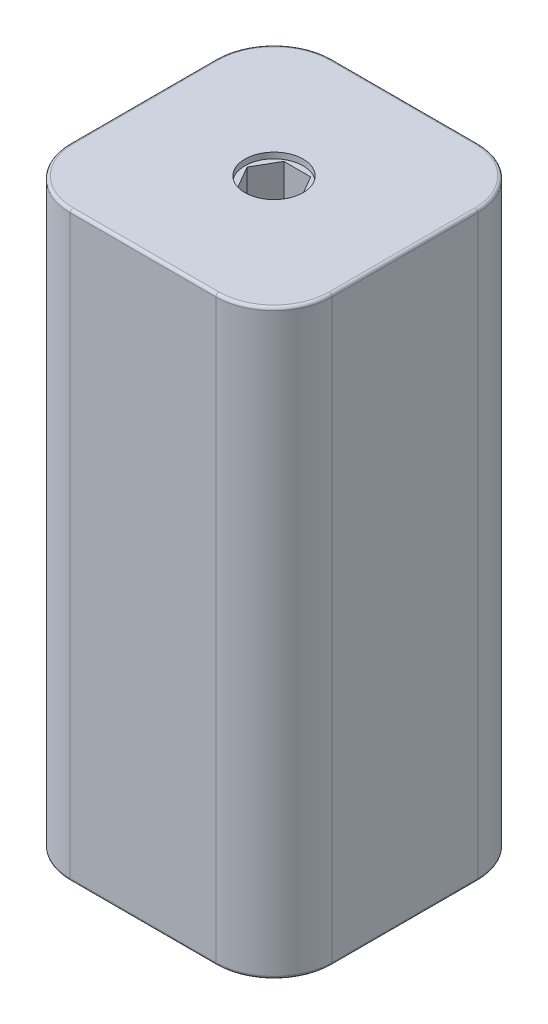
ISO-10303-21;
HEADER;
FILE_DESCRIPTION(('STEP AP214'),'2;1');
FILE_NAME('part.step','',(''),(''),'','','');
FILE_SCHEMA(('AUTOMOTIVE_DESIGN { 1 0 10303 214 1 1 1 1 }'));
ENDSEC;
DATA;
#1=APPLICATION_CONTEXT('core data for automotive mechanical design processes');
#2=APPLICATION_PROTOCOL_DEFINITION('international standard','automotive_design',2000,#1);
#3=PRODUCT_CONTEXT('',#1,'mechanical');
#4=PRODUCT('Part','Part','',(#3));
#5=PRODUCT_RELATED_PRODUCT_CATEGORY('part','',(#4));
#6=PRODUCT_DEFINITION_FORMATION('','',#4);
#7=PRODUCT_DEFINITION_CONTEXT('part definition',#1,'design');
#8=PRODUCT_DEFINITION('design','',#6,#7);
#9=PRODUCT_DEFINITION_SHAPE('','',#8);
#10=(LENGTH_UNIT() NAMED_UNIT(*) SI_UNIT(.MILLI.,.METRE.));
#11=(NAMED_UNIT(*) PLANE_ANGLE_UNIT() SI_UNIT($,.RADIAN.));
#12=(NAMED_UNIT(*) SI_UNIT($,.STERADIAN.) SOLID_ANGLE_UNIT());
#13=UNCERTAINTY_MEASURE_WITH_UNIT(LENGTH_MEASURE(1.E-05),#10,'distance_accuracy_value','');
#14=(GEOMETRIC_REPRESENTATION_CONTEXT(3) GLOBAL_UNCERTAINTY_ASSIGNED_CONTEXT((#13)) GLOBAL_UNIT_ASSIGNED_CONTEXT((#10,
#11,#12)) REPRESENTATION_CONTEXT('',''));
#15=CARTESIAN_POINT('',(0.,0.,0.));
#16=DIRECTION('',(0.,0.,1.));
#17=DIRECTION('',(1.,0.,0.));
#18=AXIS2_PLACEMENT_3D('',#15,#16,#17);
#19=CARTESIAN_POINT('',(22.5,-100.,22.5));
#20=DIRECTION('',(1.,0.,0.));
#21=DIRECTION('',(0.,0.,-1.));
#22=AXIS2_PLACEMENT_3D('',#19,#20,#21);
#23=PLANE('',#22);
#24=DIRECTION('',(0.,1.,0.));
#25=VECTOR('',#24,1.);
#26=CARTESIAN_POINT('',(22.5,-100.,-12.5));
#27=LINE('',#26,#25);
#28=CARTESIAN_POINT('',(22.5,-99.5,-12.5));
#29=VERTEX_POINT('',#28);
#30=CARTESIAN_POINT('',(22.5,-0.5,-12.5));
#31=VERTEX_POINT('',#30);
#32=EDGE_CURVE('E261',#29,#31,#27,.T.);
#33=ORIENTED_EDGE('',*,*,#32,.T.);
#34=DIRECTION('',(0.,0.,-1.));
#35=VECTOR('',#34,1.);
#36=CARTESIAN_POINT('',(22.5,-0.5,12.5));
#37=LINE('',#36,#35);
#38=CARTESIAN_POINT('',(22.5,-0.5,12.5));
#39=VERTEX_POINT('',#38);
#40=EDGE_CURVE('E294',#31,#39,#37,.F.);
#41=ORIENTED_EDGE('',*,*,#40,.T.);
#42=DIRECTION('',(0.,1.,0.));
#43=VECTOR('',#42,1.);
#44=CARTESIAN_POINT('',(22.5,-100.,12.5));
#45=LINE('',#44,#43);
#46=CARTESIAN_POINT('',(22.5,-99.5,12.5));
#47=VERTEX_POINT('',#46);
#48=EDGE_CURVE('E258',#39,#47,#45,.F.);
#49=ORIENTED_EDGE('',*,*,#48,.T.);
#50=DIRECTION('',(0.,0.,-1.));
#51=VECTOR('',#50,1.);
#52=CARTESIAN_POINT('',(22.5,-99.5,22.5));
#53=LINE('',#52,#51);
#54=EDGE_CURVE('E292',#47,#29,#53,.T.);
#55=ORIENTED_EDGE('',*,*,#54,.T.);
#56=EDGE_LOOP('',(#33,#41,#49,#55));
#57=FACE_BOUND('',#56,.T.);
#58=ADVANCED_FACE('F34',(#57),#23,.T.);
#59=CARTESIAN_POINT('',(-22.5,-100.,22.5));
#60=DIRECTION('',(0.,0.,1.));
#61=DIRECTION('',(1.,0.,0.));
#62=AXIS2_PLACEMENT_3D('',#59,#60,#61);
#63=PLANE('',#62);
#64=DIRECTION('',(0.,1.,0.));
#65=VECTOR('',#64,1.);
#66=CARTESIAN_POINT('',(12.5,-100.,22.5));
#67=LINE('',#66,#65);
#68=CARTESIAN_POINT('',(12.5,-99.5,22.5));
#69=VERTEX_POINT('',#68);
#70=CARTESIAN_POINT('',(12.5,-0.5,22.5));
#71=VERTEX_POINT('',#70);
#72=EDGE_CURVE('E267',#69,#71,#67,.T.);
#73=ORIENTED_EDGE('',*,*,#72,.T.);
#74=DIRECTION('',(1.,0.,0.));
#75=VECTOR('',#74,1.);
#76=CARTESIAN_POINT('',(-12.5,-0.5,22.5));
#77=LINE('',#76,#75);
#78=CARTESIAN_POINT('',(-12.5,-0.5,22.5));
#79=VERTEX_POINT('',#78);
#80=EDGE_CURVE('E302',#71,#79,#77,.F.);
#81=ORIENTED_EDGE('',*,*,#80,.T.);
#82=DIRECTION('',(0.,1.,0.));
#83=VECTOR('',#82,1.);
#84=CARTESIAN_POINT('',(-12.5,-100.,22.5));
#85=LINE('',#84,#83);
#86=CARTESIAN_POINT('',(-12.5,-99.5,22.5));
#87=VERTEX_POINT('',#86);
#88=EDGE_CURVE('E264',#79,#87,#85,.F.);
#89=ORIENTED_EDGE('',*,*,#88,.T.);
#90=DIRECTION('',(1.,0.,0.));
#91=VECTOR('',#90,1.);
#92=CARTESIAN_POINT('',(-22.5,-99.5,22.5));
#93=LINE('',#92,#91);
#94=EDGE_CURVE('E300',#87,#69,#93,.T.);
#95=ORIENTED_EDGE('',*,*,#94,.T.);
#96=EDGE_LOOP('',(#73,#81,#89,#95));
#97=FACE_BOUND('',#96,.T.);
#98=ADVANCED_FACE('F429',(#97),#63,.T.);
#99=CARTESIAN_POINT('',(-22.5,-100.,22.5));
#100=DIRECTION('',(-1.,0.,0.));
#101=DIRECTION('',(0.,0.,1.));
#102=AXIS2_PLACEMENT_3D('',#99,#100,#101);
#103=PLANE('',#102);
#104=DIRECTION('',(0.,1.,0.));
#105=VECTOR('',#104,1.);
#106=CARTESIAN_POINT('',(-22.5,-100.,12.5));
#107=LINE('',#106,#105);
#108=CARTESIAN_POINT('',(-22.5,-99.5,12.5));
#109=VERTEX_POINT('',#108);
#110=CARTESIAN_POINT('',(-22.5,-0.5,12.5));
#111=VERTEX_POINT('',#110);
#112=EDGE_CURVE('E252',#109,#111,#107,.T.);
#113=ORIENTED_EDGE('',*,*,#112,.T.);
#114=DIRECTION('',(0.,0.,1.));
#115=VECTOR('',#114,1.);
#116=CARTESIAN_POINT('',(-22.5,-0.5,-12.5));
#117=LINE('',#116,#115);
#118=CARTESIAN_POINT('',(-22.5,-0.5,-12.5));
#119=VERTEX_POINT('',#118);
#120=EDGE_CURVE('E311',#111,#119,#117,.F.);
#121=ORIENTED_EDGE('',*,*,#120,.T.);
#122=DIRECTION('',(0.,1.,0.));
#123=VECTOR('',#122,1.);
#124=CARTESIAN_POINT('',(-22.5,-100.,-12.5));
#125=LINE('',#124,#123);
#126=CARTESIAN_POINT('',(-22.5,-99.5,-12.5));
#127=VERTEX_POINT('',#126);
#128=EDGE_CURVE('E255',#119,#127,#125,.F.);
#129=ORIENTED_EDGE('',*,*,#128,.T.);
#130=DIRECTION('',(0.,0.,1.));
#131=VECTOR('',#130,1.);
#132=CARTESIAN_POINT('',(-22.5,-99.5,22.5));
#133=LINE('',#132,#131);
#134=EDGE_CURVE('E309',#127,#109,#133,.T.);
#135=ORIENTED_EDGE('',*,*,#134,.T.);
#136=EDGE_LOOP('',(#113,#121,#129,#135));
#137=FACE_BOUND('',#136,.T.);
#138=ADVANCED_FACE('F446',(#137),#103,.T.);
#139=CARTESIAN_POINT('',(-22.5,-100.,-22.5));
#140=DIRECTION('',(0.,0.,-1.));
#141=DIRECTION('',(-1.,0.,0.));
#142=AXIS2_PLACEMENT_3D('',#139,#140,#141);
#143=PLANE('',#142);
#144=DIRECTION('',(0.,1.,0.));
#145=VECTOR('',#144,1.);
#146=CARTESIAN_POINT('',(-12.5,-100.,-22.5));
#147=LINE('',#146,#145);
#148=CARTESIAN_POINT('',(-12.5,-99.5,-22.5));
#149=VERTEX_POINT('',#148);
#150=CARTESIAN_POINT('',(-12.5,-0.5,-22.5));
#151=VERTEX_POINT('',#150);
#152=EDGE_CURVE('E248',#149,#151,#147,.T.);
#153=ORIENTED_EDGE('',*,*,#152,.T.);
#154=DIRECTION('',(-1.,0.,0.));
#155=VECTOR('',#154,1.);
#156=CARTESIAN_POINT('',(12.5,-0.5,-22.5));
#157=LINE('',#156,#155);
#158=CARTESIAN_POINT('',(12.5,-0.5,-22.5));
#159=VERTEX_POINT('',#158);
#160=EDGE_CURVE('E319',#151,#159,#157,.F.);
#161=ORIENTED_EDGE('',*,*,#160,.T.);
#162=DIRECTION('',(0.,1.,0.));
#163=VECTOR('',#162,1.);
#164=CARTESIAN_POINT('',(12.5,-100.,-22.5));
#165=LINE('',#164,#163);
#166=CARTESIAN_POINT('',(12.5,-99.5,-22.5));
#167=VERTEX_POINT('',#166);
#168=EDGE_CURVE('E245',#159,#167,#165,.F.);
#169=ORIENTED_EDGE('',*,*,#168,.T.);
#170=DIRECTION('',(-1.,0.,0.));
#171=VECTOR('',#170,1.);
#172=CARTESIAN_POINT('',(-22.5,-99.5,-22.5));
#173=LINE('',#172,#171);
#174=EDGE_CURVE('E317',#167,#149,#173,.T.);
#175=ORIENTED_EDGE('',*,*,#174,.T.);
#176=EDGE_LOOP('',(#153,#161,#169,#175));
#177=FACE_BOUND('',#176,.T.);
#178=ADVANCED_FACE('F391',(#177),#143,.T.);
#179=CARTESIAN_POINT('',(0.,-100.,0.));
#180=DIRECTION('',(0.,-1.,0.));
#181=DIRECTION('',(0.,0.,-1.));
#182=AXIS2_PLACEMENT_3D('',#179,#180,#181);
#183=PLANE('',#182);
#184=DIRECTION('',(1.,0.,0.));
#185=VECTOR('',#184,1.);
#186=CARTESIAN_POINT('',(0.,-100.,22.));
#187=LINE('',#186,#185);
#188=CARTESIAN_POINT('',(12.5,-100.,22.));
#189=VERTEX_POINT('',#188);
#190=CARTESIAN_POINT('',(-12.5,-100.,22.));
#191=VERTEX_POINT('',#190);
#192=EDGE_CURVE('E43',#189,#191,#187,.F.);
#193=ORIENTED_EDGE('',*,*,#192,.T.);
#194=CARTESIAN_POINT('',(-12.5,-100.,12.5));
#195=DIRECTION('',(0.,-1.,0.));
#196=DIRECTION('',(0.,0.,-1.));
#197=AXIS2_PLACEMENT_3D('',#194,#195,#196);
#198=CIRCLE('',#197,9.5);
#199=CARTESIAN_POINT('',(-22.,-100.,12.5));
#200=VERTEX_POINT('',#199);
#201=EDGE_CURVE('E11',#191,#200,#198,.T.);
#202=ORIENTED_EDGE('',*,*,#201,.T.);
#203=DIRECTION('',(0.,0.,1.));
#204=VECTOR('',#203,1.);
#205=CARTESIAN_POINT('',(-22.,-100.,0.));
#206=LINE('',#205,#204);
#207=CARTESIAN_POINT('',(-22.,-100.,-12.5));
#208=VERTEX_POINT('',#207);
#209=EDGE_CURVE('E321',#200,#208,#206,.F.);
#210=ORIENTED_EDGE('',*,*,#209,.T.);
#211=CARTESIAN_POINT('',(-12.5,-100.,-12.5));
#212=DIRECTION('',(0.,-1.,0.));
#213=DIRECTION('',(0.,0.,-1.));
#214=AXIS2_PLACEMENT_3D('',#211,#212,#213);
#215=CIRCLE('',#214,9.5);
#216=CARTESIAN_POINT('',(-12.5,-100.,-22.));
#217=VERTEX_POINT('',#216);
#218=EDGE_CURVE('E323',#208,#217,#215,.T.);
#219=ORIENTED_EDGE('',*,*,#218,.T.);
#220=DIRECTION('',(-1.,0.,0.));
#221=VECTOR('',#220,1.);
#222=CARTESIAN_POINT('',(0.,-100.,-22.));
#223=LINE('',#222,#221);
#224=CARTESIAN_POINT('',(12.5,-100.,-22.));
#225=VERTEX_POINT('',#224);
#226=EDGE_CURVE('E325',#217,#225,#223,.F.);
#227=ORIENTED_EDGE('',*,*,#226,.T.);
#228=CARTESIAN_POINT('',(12.5,-100.,-12.5));
#229=DIRECTION('',(0.,-1.,0.));
#230=DIRECTION('',(0.,0.,-1.));
#231=AXIS2_PLACEMENT_3D('',#228,#229,#230);
#232=CIRCLE('',#231,9.5);
#233=CARTESIAN_POINT('',(22.,-100.,-12.5));
#234=VERTEX_POINT('',#233);
#235=EDGE_CURVE('E327',#225,#234,#232,.T.);
#236=ORIENTED_EDGE('',*,*,#235,.T.);
#237=DIRECTION('',(0.,0.,-1.));
#238=VECTOR('',#237,1.);
#239=CARTESIAN_POINT('',(22.,-100.,0.));
#240=LINE('',#239,#238);
#241=CARTESIAN_POINT('',(22.,-100.,12.5));
#242=VERTEX_POINT('',#241);
#243=EDGE_CURVE('E329',#234,#242,#240,.F.);
#244=ORIENTED_EDGE('',*,*,#243,.T.);
#245=CARTESIAN_POINT('',(12.5,-100.,12.5));
#246=DIRECTION('',(0.,-1.,0.));
#247=DIRECTION('',(0.,0.,-1.));
#248=AXIS2_PLACEMENT_3D('',#245,#246,#247);
#249=CIRCLE('',#248,9.5);
#250=EDGE_CURVE('E331',#242,#189,#249,.T.);
#251=ORIENTED_EDGE('',*,*,#250,.T.);
#252=EDGE_LOOP('',(#193,#202,#210,#219,#227,#236,#244,#251));
#253=FACE_BOUND('',#252,.T.);
#254=ADVANCED_FACE('F470',(#253),#183,.T.);
#255=CARTESIAN_POINT('',(0.,0.,0.));
#256=DIRECTION('',(0.,-1.,0.));
#257=DIRECTION('',(0.,0.,-1.));
#258=AXIS2_PLACEMENT_3D('',#255,#256,#257);
#259=PLANE('',#258);
#260=CARTESIAN_POINT('',(0.,0.,0.));
#261=DIRECTION('',(0.,1.,0.));
#262=DIRECTION('',(0.,0.,1.));
#263=AXIS2_PLACEMENT_3D('',#260,#261,#262);
#264=CIRCLE('',#263,5.);
#265=CARTESIAN_POINT('',(0.,0.,5.));
#266=VERTEX_POINT('',#265);
#267=EDGE_CURVE('E231',#266,#266,#264,.T.);
#268=ORIENTED_EDGE('',*,*,#267,.F.);
#269=EDGE_LOOP('',(#268));
#270=FACE_BOUND('',#269,.T.);
#271=DIRECTION('',(0.,0.,-1.));
#272=VECTOR('',#271,1.);
#273=CARTESIAN_POINT('',(22.,0.,-12.5));
#274=LINE('',#273,#272);
#275=CARTESIAN_POINT('',(22.,0.,12.5));
#276=VERTEX_POINT('',#275);
#277=CARTESIAN_POINT('',(22.,0.,-12.5));
#278=VERTEX_POINT('',#277);
#279=EDGE_CURVE('E282',#276,#278,#274,.T.);
#280=ORIENTED_EDGE('',*,*,#279,.T.);
#281=CARTESIAN_POINT('',(12.5,0.,-12.5));
#282=DIRECTION('',(0.,-1.,0.));
#283=DIRECTION('',(0.,0.,-1.));
#284=AXIS2_PLACEMENT_3D('',#281,#282,#283);
#285=CIRCLE('',#284,9.5);
#286=CARTESIAN_POINT('',(12.5,0.,-22.));
#287=VERTEX_POINT('',#286);
#288=EDGE_CURVE('E284',#278,#287,#285,.F.);
#289=ORIENTED_EDGE('',*,*,#288,.T.);
#290=DIRECTION('',(-1.,0.,0.));
#291=VECTOR('',#290,1.);
#292=CARTESIAN_POINT('',(-12.5,0.,-22.));
#293=LINE('',#292,#291);
#294=CARTESIAN_POINT('',(-12.5,0.,-22.));
#295=VERTEX_POINT('',#294);
#296=EDGE_CURVE('E270',#287,#295,#293,.T.);
#297=ORIENTED_EDGE('',*,*,#296,.T.);
#298=CARTESIAN_POINT('',(-12.5,0.,-12.5));
#299=DIRECTION('',(0.,-1.,0.));
#300=DIRECTION('',(0.,0.,-1.));
#301=AXIS2_PLACEMENT_3D('',#298,#299,#300);
#302=CIRCLE('',#301,9.5);
#303=CARTESIAN_POINT('',(-22.,0.,-12.5));
#304=VERTEX_POINT('',#303);
#305=EDGE_CURVE('E272',#295,#304,#302,.F.);
#306=ORIENTED_EDGE('',*,*,#305,.T.);
#307=DIRECTION('',(0.,0.,1.));
#308=VECTOR('',#307,1.);
#309=CARTESIAN_POINT('',(-22.,0.,12.5));
#310=LINE('',#309,#308);
#311=CARTESIAN_POINT('',(-22.,0.,12.5));
#312=VERTEX_POINT('',#311);
#313=EDGE_CURVE('E274',#304,#312,#310,.T.);
#314=ORIENTED_EDGE('',*,*,#313,.T.);
#315=CARTESIAN_POINT('',(-12.5,0.,12.5));
#316=DIRECTION('',(0.,-1.,0.));
#317=DIRECTION('',(0.,0.,-1.));
#318=AXIS2_PLACEMENT_3D('',#315,#316,#317);
#319=CIRCLE('',#318,9.5);
#320=CARTESIAN_POINT('',(-12.5,0.,22.));
#321=VERTEX_POINT('',#320);
#322=EDGE_CURVE('E276',#312,#321,#319,.F.);
#323=ORIENTED_EDGE('',*,*,#322,.T.);
#324=DIRECTION('',(1.,0.,0.));
#325=VECTOR('',#324,1.);
#326=CARTESIAN_POINT('',(12.5,0.,22.));
#327=LINE('',#326,#325);
#328=CARTESIAN_POINT('',(12.5,0.,22.));
#329=VERTEX_POINT('',#328);
#330=EDGE_CURVE('E278',#321,#329,#327,.T.);
#331=ORIENTED_EDGE('',*,*,#330,.T.);
#332=CARTESIAN_POINT('',(12.5,0.,12.5));
#333=DIRECTION('',(0.,-1.,0.));
#334=DIRECTION('',(0.,0.,-1.));
#335=AXIS2_PLACEMENT_3D('',#332,#333,#334);
#336=CIRCLE('',#335,9.5);
#337=EDGE_CURVE('E280',#329,#276,#336,.F.);
#338=ORIENTED_EDGE('',*,*,#337,.T.);
#339=EDGE_LOOP('',(#280,#289,#297,#306,#314,#323,#331,#338));
#340=FACE_BOUND('',#339,.T.);
#341=ADVANCED_FACE('F420',(#270,#340),#259,.F.);
#342=CARTESIAN_POINT('',(-12.5,-100.,-12.5));
#343=DIRECTION('',(0.,1.,0.));
#344=DIRECTION('',(0.,0.,1.));
#345=AXIS2_PLACEMENT_3D('',#342,#343,#344);
#346=CYLINDRICAL_SURFACE('',#345,10.);
#347=ORIENTED_EDGE('',*,*,#128,.F.);
#348=CARTESIAN_POINT('',(-12.5,-0.5,-12.5));
#349=DIRECTION('',(0.,-1.,0.));
#350=DIRECTION('',(0.,0.,-1.));
#351=AXIS2_PLACEMENT_3D('',#348,#349,#350);
#352=CIRCLE('',#351,10.);
#353=EDGE_CURVE('E315',#119,#151,#352,.T.);
#354=ORIENTED_EDGE('',*,*,#353,.T.);
#355=ORIENTED_EDGE('',*,*,#152,.F.);
#356=CARTESIAN_POINT('',(-12.5,-99.5,-12.5));
#357=DIRECTION('',(0.,-1.,0.));
#358=DIRECTION('',(0.,0.,-1.));
#359=AXIS2_PLACEMENT_3D('',#356,#357,#358);
#360=CIRCLE('',#359,10.);
#361=EDGE_CURVE('E313',#149,#127,#360,.F.);
#362=ORIENTED_EDGE('',*,*,#361,.T.);
#363=EDGE_LOOP('',(#347,#354,#355,#362));
#364=FACE_BOUND('',#363,.T.);
#365=ADVANCED_FACE('F449',(#364),#346,.T.);
#366=CARTESIAN_POINT('',(12.5,-100.,-12.5));
#367=DIRECTION('',(0.,1.,0.));
#368=DIRECTION('',(0.,0.,1.));
#369=AXIS2_PLACEMENT_3D('',#366,#367,#368);
#370=CYLINDRICAL_SURFACE('',#369,10.);
#371=ORIENTED_EDGE('',*,*,#168,.F.);
#372=CARTESIAN_POINT('',(12.5,-0.5,-12.5));
#373=DIRECTION('',(0.,-1.,0.));
#374=DIRECTION('',(0.,0.,-1.));
#375=AXIS2_PLACEMENT_3D('',#372,#373,#374);
#376=CIRCLE('',#375,10.);
#377=EDGE_CURVE('E289',#159,#31,#376,.T.);
#378=ORIENTED_EDGE('',*,*,#377,.T.);
#379=ORIENTED_EDGE('',*,*,#32,.F.);
#380=CARTESIAN_POINT('',(12.5,-99.5,-12.5));
#381=DIRECTION('',(0.,-1.,0.));
#382=DIRECTION('',(0.,0.,-1.));
#383=AXIS2_PLACEMENT_3D('',#380,#381,#382);
#384=CIRCLE('',#383,10.);
#385=EDGE_CURVE('E287',#29,#167,#384,.F.);
#386=ORIENTED_EDGE('',*,*,#385,.T.);
#387=EDGE_LOOP('',(#371,#378,#379,#386));
#388=FACE_BOUND('',#387,.T.);
#389=ADVANCED_FACE('F388',(#388),#370,.T.);
#390=CARTESIAN_POINT('',(12.5,-100.,12.5));
#391=DIRECTION('',(0.,1.,0.));
#392=DIRECTION('',(0.,0.,1.));
#393=AXIS2_PLACEMENT_3D('',#390,#391,#392);
#394=CYLINDRICAL_SURFACE('',#393,10.);
#395=ORIENTED_EDGE('',*,*,#48,.F.);
#396=CARTESIAN_POINT('',(12.5,-0.5,12.5));
#397=DIRECTION('',(0.,-1.,0.));
#398=DIRECTION('',(0.,0.,-1.));
#399=AXIS2_PLACEMENT_3D('',#396,#397,#398);
#400=CIRCLE('',#399,10.);
#401=EDGE_CURVE('E298',#39,#71,#400,.T.);
#402=ORIENTED_EDGE('',*,*,#401,.T.);
#403=ORIENTED_EDGE('',*,*,#72,.F.);
#404=CARTESIAN_POINT('',(12.5,-99.5,12.5));
#405=DIRECTION('',(0.,-1.,0.));
#406=DIRECTION('',(0.,0.,-1.));
#407=AXIS2_PLACEMENT_3D('',#404,#405,#406);
#408=CIRCLE('',#407,10.);
#409=EDGE_CURVE('E296',#69,#47,#408,.F.);
#410=ORIENTED_EDGE('',*,*,#409,.T.);
#411=EDGE_LOOP('',(#395,#402,#403,#410));
#412=FACE_BOUND('',#411,.T.);
#413=ADVANCED_FACE('F408',(#412),#394,.T.);
#414=CARTESIAN_POINT('',(-12.5,-100.,12.5));
#415=DIRECTION('',(0.,1.,0.));
#416=DIRECTION('',(0.,0.,1.));
#417=AXIS2_PLACEMENT_3D('',#414,#415,#416);
#418=CYLINDRICAL_SURFACE('',#417,10.);
#419=ORIENTED_EDGE('',*,*,#88,.F.);
#420=CARTESIAN_POINT('',(-12.5,-0.5,12.5));
#421=DIRECTION('',(0.,-1.,0.));
#422=DIRECTION('',(0.,0.,-1.));
#423=AXIS2_PLACEMENT_3D('',#420,#421,#422);
#424=CIRCLE('',#423,10.);
#425=EDGE_CURVE('E307',#79,#111,#424,.T.);
#426=ORIENTED_EDGE('',*,*,#425,.T.);
#427=ORIENTED_EDGE('',*,*,#112,.F.);
#428=CARTESIAN_POINT('',(-12.5,-99.5,12.5));
#429=DIRECTION('',(0.,-1.,0.));
#430=DIRECTION('',(0.,0.,-1.));
#431=AXIS2_PLACEMENT_3D('',#428,#429,#430);
#432=CIRCLE('',#431,10.);
#433=EDGE_CURVE('E304',#109,#87,#432,.F.);
#434=ORIENTED_EDGE('',*,*,#433,.T.);
#435=EDGE_LOOP('',(#419,#426,#427,#434));
#436=FACE_BOUND('',#435,.T.);
#437=ADVANCED_FACE('F432',(#436),#418,.T.);
#438=CARTESIAN_POINT('',(-12.5,-0.5,12.5));
#439=DIRECTION('',(0.,-1.,0.));
#440=DIRECTION('',(0.,0.,-1.));
#441=AXIS2_PLACEMENT_3D('',#438,#439,#440);
#442=TOROIDAL_SURFACE('',#441,9.5,0.5);
#443=CARTESIAN_POINT('',(-22.,-0.5,12.5));
#444=DIRECTION('',(0.,0.,-1.));
#445=DIRECTION('',(-1.,0.,0.));
#446=AXIS2_PLACEMENT_3D('',#443,#444,#445);
#447=CIRCLE('',#446,0.5);
#448=EDGE_CURVE('E350',#111,#312,#447,.T.);
#449=ORIENTED_EDGE('',*,*,#448,.F.);
#450=ORIENTED_EDGE('',*,*,#425,.F.);
#451=CARTESIAN_POINT('',(-12.5,-0.5,22.));
#452=DIRECTION('',(1.,0.,0.));
#453=DIRECTION('',(0.,0.,-1.));
#454=AXIS2_PLACEMENT_3D('',#451,#452,#453);
#455=CIRCLE('',#454,0.5);
#456=EDGE_CURVE('E249',#321,#79,#455,.T.);
#457=ORIENTED_EDGE('',*,*,#456,.F.);
#458=ORIENTED_EDGE('',*,*,#322,.F.);
#459=EDGE_LOOP('',(#449,#450,#457,#458));
#460=FACE_BOUND('',#459,.T.);
#461=ADVANCED_FACE('F437',(#460),#442,.T.);
#462=CARTESIAN_POINT('',(0.,-0.5,22.));
#463=DIRECTION('',(-1.,0.,0.));
#464=DIRECTION('',(0.,0.,1.));
#465=AXIS2_PLACEMENT_3D('',#462,#463,#464);
#466=CYLINDRICAL_SURFACE('',#465,0.5);
#467=ORIENTED_EDGE('',*,*,#456,.T.);
#468=ORIENTED_EDGE('',*,*,#80,.F.);
#469=CARTESIAN_POINT('',(12.5,-0.5,22.));
#470=DIRECTION('',(1.,0.,0.));
#471=DIRECTION('',(0.,0.,-1.));
#472=AXIS2_PLACEMENT_3D('',#469,#470,#471);
#473=CIRCLE('',#472,0.5);
#474=EDGE_CURVE('E347',#329,#71,#473,.T.);
#475=ORIENTED_EDGE('',*,*,#474,.F.);
#476=ORIENTED_EDGE('',*,*,#330,.F.);
#477=EDGE_LOOP('',(#467,#468,#475,#476));
#478=FACE_BOUND('',#477,.T.);
#479=ADVANCED_FACE('F426',(#478),#466,.T.);
#480=CARTESIAN_POINT('',(-22.,-0.5,0.));
#481=DIRECTION('',(0.,0.,-1.));
#482=DIRECTION('',(-1.,0.,0.));
#483=AXIS2_PLACEMENT_3D('',#480,#481,#482);
#484=CYLINDRICAL_SURFACE('',#483,0.5);
#485=ORIENTED_EDGE('',*,*,#448,.T.);
#486=ORIENTED_EDGE('',*,*,#313,.F.);
#487=CARTESIAN_POINT('',(-22.,-0.5,-12.5));
#488=DIRECTION('',(0.,0.,-1.));
#489=DIRECTION('',(-1.,0.,0.));
#490=AXIS2_PLACEMENT_3D('',#487,#488,#489);
#491=CIRCLE('',#490,0.5);
#492=EDGE_CURVE('E344',#119,#304,#491,.T.);
#493=ORIENTED_EDGE('',*,*,#492,.F.);
#494=ORIENTED_EDGE('',*,*,#120,.F.);
#495=EDGE_LOOP('',(#485,#486,#493,#494));
#496=FACE_BOUND('',#495,.T.);
#497=ADVANCED_FACE('F442',(#496),#484,.T.);
#498=CARTESIAN_POINT('',(12.5,-0.5,12.5));
#499=DIRECTION('',(0.,-1.,0.));
#500=DIRECTION('',(0.,0.,-1.));
#501=AXIS2_PLACEMENT_3D('',#498,#499,#500);
#502=TOROIDAL_SURFACE('',#501,9.5,0.5);
#503=ORIENTED_EDGE('',*,*,#474,.T.);
#504=ORIENTED_EDGE('',*,*,#401,.F.);
#505=CARTESIAN_POINT('',(22.,-0.5,12.5));
#506=DIRECTION('',(0.,0.,-1.));
#507=DIRECTION('',(-1.,0.,0.));
#508=AXIS2_PLACEMENT_3D('',#505,#506,#507);
#509=CIRCLE('',#508,0.5);
#510=EDGE_CURVE('E341',#276,#39,#509,.T.);
#511=ORIENTED_EDGE('',*,*,#510,.F.);
#512=ORIENTED_EDGE('',*,*,#337,.F.);
#513=EDGE_LOOP('',(#503,#504,#511,#512));
#514=FACE_BOUND('',#513,.T.);
#515=ADVANCED_FACE('F413',(#514),#502,.T.);
#516=CARTESIAN_POINT('',(-12.5,-0.5,-12.5));
#517=DIRECTION('',(0.,-1.,0.));
#518=DIRECTION('',(0.,0.,-1.));
#519=AXIS2_PLACEMENT_3D('',#516,#517,#518);
#520=TOROIDAL_SURFACE('',#519,9.5,0.5);
#521=ORIENTED_EDGE('',*,*,#492,.T.);
#522=ORIENTED_EDGE('',*,*,#305,.F.);
#523=CARTESIAN_POINT('',(-12.5,-0.5,-22.));
#524=DIRECTION('',(1.,0.,0.));
#525=DIRECTION('',(0.,0.,-1.));
#526=AXIS2_PLACEMENT_3D('',#523,#524,#525);
#527=CIRCLE('',#526,0.5);
#528=EDGE_CURVE('E338',#151,#295,#527,.T.);
#529=ORIENTED_EDGE('',*,*,#528,.F.);
#530=ORIENTED_EDGE('',*,*,#353,.F.);
#531=EDGE_LOOP('',(#521,#522,#529,#530));
#532=FACE_BOUND('',#531,.T.);
#533=ADVANCED_FACE('F502',(#532),#520,.T.);
#534=CARTESIAN_POINT('',(22.,-0.5,0.));
#535=DIRECTION('',(0.,0.,1.));
#536=DIRECTION('',(1.,0.,0.));
#537=AXIS2_PLACEMENT_3D('',#534,#535,#536);
#538=CYLINDRICAL_SURFACE('',#537,0.5);
#539=ORIENTED_EDGE('',*,*,#510,.T.);
#540=ORIENTED_EDGE('',*,*,#40,.F.);
#541=CARTESIAN_POINT('',(22.,-0.5,-12.5));
#542=DIRECTION('',(0.,0.,-1.));
#543=DIRECTION('',(-1.,0.,0.));
#544=AXIS2_PLACEMENT_3D('',#541,#542,#543);
#545=CIRCLE('',#544,0.5);
#546=EDGE_CURVE('E336',#278,#31,#545,.T.);
#547=ORIENTED_EDGE('',*,*,#546,.F.);
#548=ORIENTED_EDGE('',*,*,#279,.F.);
#549=EDGE_LOOP('',(#539,#540,#547,#548));
#550=FACE_BOUND('',#549,.T.);
#551=ADVANCED_FACE('F418',(#550),#538,.T.);
#552=CARTESIAN_POINT('',(0.,-0.5,-22.));
#553=DIRECTION('',(1.,0.,0.));
#554=DIRECTION('',(0.,0.,-1.));
#555=AXIS2_PLACEMENT_3D('',#552,#553,#554);
#556=CYLINDRICAL_SURFACE('',#555,0.5);
#557=ORIENTED_EDGE('',*,*,#528,.T.);
#558=ORIENTED_EDGE('',*,*,#296,.F.);
#559=CARTESIAN_POINT('',(12.5,-0.5,-22.));
#560=DIRECTION('',(1.,0.,0.));
#561=DIRECTION('',(0.,0.,-1.));
#562=AXIS2_PLACEMENT_3D('',#559,#560,#561);
#563=CIRCLE('',#562,0.5);
#564=EDGE_CURVE('E334',#159,#287,#563,.T.);
#565=ORIENTED_EDGE('',*,*,#564,.F.);
#566=ORIENTED_EDGE('',*,*,#160,.F.);
#567=EDGE_LOOP('',(#557,#558,#565,#566));
#568=FACE_BOUND('',#567,.T.);
#569=ADVANCED_FACE('F397',(#568),#556,.T.);
#570=CARTESIAN_POINT('',(12.5,-0.5,-12.5));
#571=DIRECTION('',(0.,-1.,0.));
#572=DIRECTION('',(0.,0.,-1.));
#573=AXIS2_PLACEMENT_3D('',#570,#571,#572);
#574=TOROIDAL_SURFACE('',#573,9.5,0.5);
#575=ORIENTED_EDGE('',*,*,#546,.T.);
#576=ORIENTED_EDGE('',*,*,#377,.F.);
#577=ORIENTED_EDGE('',*,*,#564,.T.);
#578=ORIENTED_EDGE('',*,*,#288,.F.);
#579=EDGE_LOOP('',(#575,#576,#577,#578));
#580=FACE_BOUND('',#579,.T.);
#581=ADVANCED_FACE('F401',(#580),#574,.T.);
#582=CARTESIAN_POINT('',(12.5,-99.5,-12.5));
#583=DIRECTION('',(0.,-1.,0.));
#584=DIRECTION('',(0.,0.,-1.));
#585=AXIS2_PLACEMENT_3D('',#582,#583,#584);
#586=TOROIDAL_SURFACE('',#585,9.5,0.5);
#587=CARTESIAN_POINT('',(12.5,-99.5,-22.));
#588=DIRECTION('',(-1.,0.,0.));
#589=DIRECTION('',(0.,0.,1.));
#590=AXIS2_PLACEMENT_3D('',#587,#588,#589);
#591=CIRCLE('',#590,0.5);
#592=EDGE_CURVE('E369',#167,#225,#591,.T.);
#593=ORIENTED_EDGE('',*,*,#592,.F.);
#594=ORIENTED_EDGE('',*,*,#385,.F.);
#595=CARTESIAN_POINT('',(22.,-99.5,-12.5));
#596=DIRECTION('',(0.,0.,1.));
#597=DIRECTION('',(1.,0.,0.));
#598=AXIS2_PLACEMENT_3D('',#595,#596,#597);
#599=CIRCLE('',#598,0.5);
#600=EDGE_CURVE('E38',#234,#29,#599,.T.);
#601=ORIENTED_EDGE('',*,*,#600,.F.);
#602=ORIENTED_EDGE('',*,*,#235,.F.);
#603=EDGE_LOOP('',(#593,#594,#601,#602));
#604=FACE_BOUND('',#603,.T.);
#605=ADVANCED_FACE('F36',(#604),#586,.T.);
#606=CARTESIAN_POINT('',(22.,-99.5,22.5));
#607=DIRECTION('',(0.,0.,-1.));
#608=DIRECTION('',(-1.,0.,0.));
#609=AXIS2_PLACEMENT_3D('',#606,#607,#608);
#610=CYLINDRICAL_SURFACE('',#609,0.5);
#611=ORIENTED_EDGE('',*,*,#600,.T.);
#612=ORIENTED_EDGE('',*,*,#54,.F.);
#613=CARTESIAN_POINT('',(22.,-99.5,12.5));
#614=DIRECTION('',(0.,0.,1.));
#615=DIRECTION('',(1.,0.,0.));
#616=AXIS2_PLACEMENT_3D('',#613,#614,#615);
#617=CIRCLE('',#616,0.5);
#618=EDGE_CURVE('E367',#242,#47,#617,.T.);
#619=ORIENTED_EDGE('',*,*,#618,.F.);
#620=ORIENTED_EDGE('',*,*,#243,.F.);
#621=EDGE_LOOP('',(#611,#612,#619,#620));
#622=FACE_BOUND('',#621,.T.);
#623=ADVANCED_FACE('F380',(#622),#610,.T.);
#624=CARTESIAN_POINT('',(-22.5,-99.5,-22.));
#625=DIRECTION('',(-1.,0.,0.));
#626=DIRECTION('',(0.,0.,1.));
#627=AXIS2_PLACEMENT_3D('',#624,#625,#626);
#628=CYLINDRICAL_SURFACE('',#627,0.5);
#629=ORIENTED_EDGE('',*,*,#592,.T.);
#630=ORIENTED_EDGE('',*,*,#226,.F.);
#631=CARTESIAN_POINT('',(-12.5,-99.5,-22.));
#632=DIRECTION('',(-1.,0.,0.));
#633=DIRECTION('',(0.,0.,1.));
#634=AXIS2_PLACEMENT_3D('',#631,#632,#633);
#635=CIRCLE('',#634,0.5);
#636=EDGE_CURVE('E364',#149,#217,#635,.T.);
#637=ORIENTED_EDGE('',*,*,#636,.F.);
#638=ORIENTED_EDGE('',*,*,#174,.F.);
#639=EDGE_LOOP('',(#629,#630,#637,#638));
#640=FACE_BOUND('',#639,.T.);
#641=ADVANCED_FACE('F471',(#640),#628,.T.);
#642=CARTESIAN_POINT('',(12.5,-99.5,12.5));
#643=DIRECTION('',(0.,-1.,0.));
#644=DIRECTION('',(0.,0.,-1.));
#645=AXIS2_PLACEMENT_3D('',#642,#643,#644);
#646=TOROIDAL_SURFACE('',#645,9.5,0.5);
#647=ORIENTED_EDGE('',*,*,#618,.T.);
#648=ORIENTED_EDGE('',*,*,#409,.F.);
#649=CARTESIAN_POINT('',(12.5,-99.5,22.));
#650=DIRECTION('',(-1.,0.,0.));
#651=DIRECTION('',(0.,0.,1.));
#652=AXIS2_PLACEMENT_3D('',#649,#650,#651);
#653=CIRCLE('',#652,0.5);
#654=EDGE_CURVE('E361',#189,#69,#653,.T.);
#655=ORIENTED_EDGE('',*,*,#654,.F.);
#656=ORIENTED_EDGE('',*,*,#250,.F.);
#657=EDGE_LOOP('',(#647,#648,#655,#656));
#658=FACE_BOUND('',#657,.T.);
#659=ADVANCED_FACE('F468',(#658),#646,.T.);
#660=CARTESIAN_POINT('',(-12.5,-99.5,-12.5));
#661=DIRECTION('',(0.,-1.,0.));
#662=DIRECTION('',(0.,0.,-1.));
#663=AXIS2_PLACEMENT_3D('',#660,#661,#662);
#664=TOROIDAL_SURFACE('',#663,9.5,0.5);
#665=ORIENTED_EDGE('',*,*,#636,.T.);
#666=ORIENTED_EDGE('',*,*,#218,.F.);
#667=CARTESIAN_POINT('',(-22.,-99.5,-12.5));
#668=DIRECTION('',(0.,0.,1.));
#669=DIRECTION('',(1.,0.,0.));
#670=AXIS2_PLACEMENT_3D('',#667,#668,#669);
#671=CIRCLE('',#670,0.5);
#672=EDGE_CURVE('E358',#127,#208,#671,.T.);
#673=ORIENTED_EDGE('',*,*,#672,.F.);
#674=ORIENTED_EDGE('',*,*,#361,.F.);
#675=EDGE_LOOP('',(#665,#666,#673,#674));
#676=FACE_BOUND('',#675,.T.);
#677=ADVANCED_FACE('F453',(#676),#664,.T.);
#678=CARTESIAN_POINT('',(-22.5,-99.5,22.));
#679=DIRECTION('',(1.,0.,0.));
#680=DIRECTION('',(0.,0.,-1.));
#681=AXIS2_PLACEMENT_3D('',#678,#679,#680);
#682=CYLINDRICAL_SURFACE('',#681,0.5);
#683=ORIENTED_EDGE('',*,*,#654,.T.);
#684=ORIENTED_EDGE('',*,*,#94,.F.);
#685=CARTESIAN_POINT('',(-12.5,-99.5,22.));
#686=DIRECTION('',(-1.,0.,0.));
#687=DIRECTION('',(0.,0.,1.));
#688=AXIS2_PLACEMENT_3D('',#685,#686,#687);
#689=CIRCLE('',#688,0.5);
#690=EDGE_CURVE('E356',#191,#87,#689,.T.);
#691=ORIENTED_EDGE('',*,*,#690,.F.);
#692=ORIENTED_EDGE('',*,*,#192,.F.);
#693=EDGE_LOOP('',(#683,#684,#691,#692));
#694=FACE_BOUND('',#693,.T.);
#695=ADVANCED_FACE('F465',(#694),#682,.T.);
#696=CARTESIAN_POINT('',(-22.,-99.5,22.5));
#697=DIRECTION('',(0.,0.,1.));
#698=DIRECTION('',(1.,0.,0.));
#699=AXIS2_PLACEMENT_3D('',#696,#697,#698);
#700=CYLINDRICAL_SURFACE('',#699,0.5);
#701=ORIENTED_EDGE('',*,*,#672,.T.);
#702=ORIENTED_EDGE('',*,*,#209,.F.);
#703=CARTESIAN_POINT('',(-22.,-99.5,12.5));
#704=DIRECTION('',(0.,0.,1.));
#705=DIRECTION('',(1.,0.,0.));
#706=AXIS2_PLACEMENT_3D('',#703,#704,#705);
#707=CIRCLE('',#706,0.5);
#708=EDGE_CURVE('E242',#109,#200,#707,.T.);
#709=ORIENTED_EDGE('',*,*,#708,.F.);
#710=ORIENTED_EDGE('',*,*,#134,.F.);
#711=EDGE_LOOP('',(#701,#702,#709,#710));
#712=FACE_BOUND('',#711,.T.);
#713=ADVANCED_FACE('F459',(#712),#700,.T.);
#714=CARTESIAN_POINT('',(-12.5,-99.5,12.5));
#715=DIRECTION('',(0.,-1.,0.));
#716=DIRECTION('',(0.,0.,-1.));
#717=AXIS2_PLACEMENT_3D('',#714,#715,#716);
#718=TOROIDAL_SURFACE('',#717,9.5,0.5);
#719=ORIENTED_EDGE('',*,*,#690,.T.);
#720=ORIENTED_EDGE('',*,*,#433,.F.);
#721=ORIENTED_EDGE('',*,*,#708,.T.);
#722=ORIENTED_EDGE('',*,*,#201,.F.);
#723=EDGE_LOOP('',(#719,#720,#721,#722));
#724=FACE_BOUND('',#723,.T.);
#725=ADVANCED_FACE('F461',(#724),#718,.T.);
#726=CARTESIAN_POINT('',(0.,-1.,0.));
#727=DIRECTION('',(0.,1.,0.));
#728=DIRECTION('',(0.,0.,1.));
#729=AXIS2_PLACEMENT_3D('',#726,#727,#728);
#730=CYLINDRICAL_SURFACE('',#729,5.);
#731=CARTESIAN_POINT('',(0.,-1.,0.));
#732=DIRECTION('',(0.,1.,0.));
#733=DIRECTION('',(0.,0.,1.));
#734=AXIS2_PLACEMENT_3D('',#731,#732,#733);
#735=CIRCLE('',#734,5.);
#736=CARTESIAN_POINT('',(0.,-1.,5.));
#737=VERTEX_POINT('',#736);
#738=EDGE_CURVE('E239',#737,#737,#735,.T.);
#739=ORIENTED_EDGE('',*,*,#738,.F.);
#740=EDGE_LOOP('',(#739));
#741=FACE_BOUND('',#740,.T.);
#742=ORIENTED_EDGE('',*,*,#267,.T.);
#743=EDGE_LOOP('',(#742));
#744=FACE_BOUND('',#743,.T.);
#745=ADVANCED_FACE('F516',(#741,#744),#730,.F.);
#746=CARTESIAN_POINT('',(0.,-1.,0.));
#747=DIRECTION('',(0.,1.,0.));
#748=DIRECTION('',(0.,0.,1.));
#749=AXIS2_PLACEMENT_3D('',#746,#747,#748);
#750=PLANE('',#749);
#751=DIRECTION('',(0.499999999999999,0.,-0.866025403784439));
#752=VECTOR('',#751,1.);
#753=CARTESIAN_POINT('',(2.30940107675851,-1.,4.));
#754=LINE('',#753,#752);
#755=CARTESIAN_POINT('',(2.30940107675851,-1.,4.));
#756=VERTEX_POINT('',#755);
#757=CARTESIAN_POINT('',(4.61880215351701,-1.,0.));
#758=VERTEX_POINT('',#757);
#759=EDGE_CURVE('E51',#756,#758,#754,.T.);
#760=ORIENTED_EDGE('',*,*,#759,.F.);
#761=DIRECTION('',(1.,0.,0.));
#762=VECTOR('',#761,1.);
#763=CARTESIAN_POINT('',(-2.3094010767585,-1.,4.));
#764=LINE('',#763,#762);
#765=CARTESIAN_POINT('',(-2.3094010767585,-1.,4.));
#766=VERTEX_POINT('',#765);
#767=EDGE_CURVE('E205',#766,#756,#764,.T.);
#768=ORIENTED_EDGE('',*,*,#767,.F.);
#769=DIRECTION('',(0.5,0.,0.866025403784438));
#770=VECTOR('',#769,1.);
#771=CARTESIAN_POINT('',(-4.61880215351701,-1.,0.));
#772=LINE('',#771,#770);
#773=CARTESIAN_POINT('',(-4.61880215351701,-1.,0.));
#774=VERTEX_POINT('',#773);
#775=EDGE_CURVE('E208',#774,#766,#772,.T.);
#776=ORIENTED_EDGE('',*,*,#775,.F.);
#777=DIRECTION('',(-0.499999999999999,0.,0.866025403784439));
#778=VECTOR('',#777,1.);
#779=CARTESIAN_POINT('',(-2.3094010767585,-1.,-4.));
#780=LINE('',#779,#778);
#781=CARTESIAN_POINT('',(-2.3094010767585,-1.,-4.));
#782=VERTEX_POINT('',#781);
#783=EDGE_CURVE('E224',#782,#774,#780,.T.);
#784=ORIENTED_EDGE('',*,*,#783,.F.);
#785=DIRECTION('',(-1.,0.,0.));
#786=VECTOR('',#785,1.);
#787=CARTESIAN_POINT('',(2.3094010767585,-1.,-4.));
#788=LINE('',#787,#786);
#789=CARTESIAN_POINT('',(2.3094010767585,-1.,-4.));
#790=VERTEX_POINT('',#789);
#791=EDGE_CURVE('E221',#790,#782,#788,.T.);
#792=ORIENTED_EDGE('',*,*,#791,.F.);
#793=DIRECTION('',(-0.5,0.,-0.866025403784438));
#794=VECTOR('',#793,1.);
#795=CARTESIAN_POINT('',(4.61880215351701,-1.,0.));
#796=LINE('',#795,#794);
#797=EDGE_CURVE('E219',#758,#790,#796,.T.);
#798=ORIENTED_EDGE('',*,*,#797,.F.);
#799=EDGE_LOOP('',(#760,#768,#776,#784,#792,#798));
#800=FACE_BOUND('',#799,.T.);
#801=ORIENTED_EDGE('',*,*,#738,.T.);
#802=EDGE_LOOP('',(#801));
#803=FACE_BOUND('',#802,.T.);
#804=ADVANCED_FACE('F545',(#800,#803),#750,.T.);
#805=CARTESIAN_POINT('',(2.30940107675851,-13.,4.));
#806=DIRECTION('',(0.866025403784439,0.,0.499999999999999));
#807=DIRECTION('',(0.499999999999999,0.,-0.866025403784439));
#808=AXIS2_PLACEMENT_3D('',#805,#806,#807);
#809=PLANE('',#808);
#810=ORIENTED_EDGE('',*,*,#759,.T.);
#811=DIRECTION('',(0.,1.,0.));
#812=VECTOR('',#811,1.);
#813=CARTESIAN_POINT('',(4.61880215351701,-13.,0.));
#814=LINE('',#813,#812);
#815=CARTESIAN_POINT('',(4.61880215351701,-13.,0.));
#816=VERTEX_POINT('',#815);
#817=EDGE_CURVE('E182',#816,#758,#814,.T.);
#818=ORIENTED_EDGE('',*,*,#817,.F.);
#819=DIRECTION('',(0.499999999999999,0.,-0.866025403784439));
#820=VECTOR('',#819,1.);
#821=CARTESIAN_POINT('',(2.30940107675851,-13.,4.));
#822=LINE('',#821,#820);
#823=CARTESIAN_POINT('',(2.30940107675851,-13.,4.));
#824=VERTEX_POINT('',#823);
#825=EDGE_CURVE('E186',#824,#816,#822,.T.);
#826=ORIENTED_EDGE('',*,*,#825,.F.);
#827=DIRECTION('',(0.,1.,0.));
#828=VECTOR('',#827,1.);
#829=CARTESIAN_POINT('',(2.30940107675851,-13.,4.));
#830=LINE('',#829,#828);
#831=EDGE_CURVE('E229',#824,#756,#830,.T.);
#832=ORIENTED_EDGE('',*,*,#831,.T.);
#833=EDGE_LOOP('',(#810,#818,#826,#832));
#834=FACE_BOUND('',#833,.T.);
#835=ADVANCED_FACE('F184',(#834),#809,.F.);
#836=CARTESIAN_POINT('',(-2.3094010767585,-13.,4.));
#837=DIRECTION('',(0.,0.,1.));
#838=DIRECTION('',(1.,0.,0.));
#839=AXIS2_PLACEMENT_3D('',#836,#837,#838);
#840=PLANE('',#839);
#841=ORIENTED_EDGE('',*,*,#767,.T.);
#842=ORIENTED_EDGE('',*,*,#831,.F.);
#843=DIRECTION('',(1.,0.,0.));
#844=VECTOR('',#843,1.);
#845=CARTESIAN_POINT('',(-2.3094010767585,-13.,4.));
#846=LINE('',#845,#844);
#847=CARTESIAN_POINT('',(-2.3094010767585,-13.,4.));
#848=VERTEX_POINT('',#847);
#849=EDGE_CURVE('E192',#848,#824,#846,.T.);
#850=ORIENTED_EDGE('',*,*,#849,.F.);
#851=DIRECTION('',(0.,1.,0.));
#852=VECTOR('',#851,1.);
#853=CARTESIAN_POINT('',(-2.3094010767585,-13.,4.));
#854=LINE('',#853,#852);
#855=EDGE_CURVE('E232',#848,#766,#854,.T.);
#856=ORIENTED_EDGE('',*,*,#855,.T.);
#857=EDGE_LOOP('',(#841,#842,#850,#856));
#858=FACE_BOUND('',#857,.T.);
#859=ADVANCED_FACE('F560',(#858),#840,.F.);
#860=CARTESIAN_POINT('',(-4.61880215351701,-13.,0.));
#861=DIRECTION('',(-0.866025403784439,0.,0.5));
#862=DIRECTION('',(0.5,0.,0.866025403784439));
#863=AXIS2_PLACEMENT_3D('',#860,#861,#862);
#864=PLANE('',#863);
#865=ORIENTED_EDGE('',*,*,#775,.T.);
#866=ORIENTED_EDGE('',*,*,#855,.F.);
#867=DIRECTION('',(0.5,0.,0.866025403784438));
#868=VECTOR('',#867,1.);
#869=CARTESIAN_POINT('',(-4.61880215351701,-13.,0.));
#870=LINE('',#869,#868);
#871=CARTESIAN_POINT('',(-4.61880215351701,-13.,0.));
#872=VERTEX_POINT('',#871);
#873=EDGE_CURVE('E215',#872,#848,#870,.T.);
#874=ORIENTED_EDGE('',*,*,#873,.F.);
#875=DIRECTION('',(0.,1.,0.));
#876=VECTOR('',#875,1.);
#877=CARTESIAN_POINT('',(-4.61880215351701,-13.,0.));
#878=LINE('',#877,#876);
#879=EDGE_CURVE('E234',#872,#774,#878,.T.);
#880=ORIENTED_EDGE('',*,*,#879,.T.);
#881=EDGE_LOOP('',(#865,#866,#874,#880));
#882=FACE_BOUND('',#881,.T.);
#883=ADVANCED_FACE('F567',(#882),#864,.F.);
#884=CARTESIAN_POINT('',(-2.3094010767585,-13.,-4.));
#885=DIRECTION('',(-0.866025403784439,0.,-0.499999999999999));
#886=DIRECTION('',(-0.499999999999999,0.,0.866025403784439));
#887=AXIS2_PLACEMENT_3D('',#884,#885,#886);
#888=PLANE('',#887);
#889=ORIENTED_EDGE('',*,*,#783,.T.);
#890=ORIENTED_EDGE('',*,*,#879,.F.);
#891=DIRECTION('',(-0.499999999999999,0.,0.866025403784439));
#892=VECTOR('',#891,1.);
#893=CARTESIAN_POINT('',(-2.3094010767585,-13.,-4.));
#894=LINE('',#893,#892);
#895=CARTESIAN_POINT('',(-2.3094010767585,-13.,-4.));
#896=VERTEX_POINT('',#895);
#897=EDGE_CURVE('E212',#896,#872,#894,.T.);
#898=ORIENTED_EDGE('',*,*,#897,.F.);
#899=DIRECTION('',(0.,1.,0.));
#900=VECTOR('',#899,1.);
#901=CARTESIAN_POINT('',(-2.3094010767585,-13.,-4.));
#902=LINE('',#901,#900);
#903=EDGE_CURVE('E236',#896,#782,#902,.T.);
#904=ORIENTED_EDGE('',*,*,#903,.T.);
#905=EDGE_LOOP('',(#889,#890,#898,#904));
#906=FACE_BOUND('',#905,.T.);
#907=ADVANCED_FACE('F575',(#906),#888,.F.);
#908=CARTESIAN_POINT('',(2.3094010767585,-13.,-4.));
#909=DIRECTION('',(0.,0.,-1.));
#910=DIRECTION('',(-1.,0.,0.));
#911=AXIS2_PLACEMENT_3D('',#908,#909,#910);
#912=PLANE('',#911);
#913=ORIENTED_EDGE('',*,*,#791,.T.);
#914=ORIENTED_EDGE('',*,*,#903,.F.);
#915=DIRECTION('',(-1.,0.,0.));
#916=VECTOR('',#915,1.);
#917=CARTESIAN_POINT('',(2.3094010767585,-13.,-4.));
#918=LINE('',#917,#916);
#919=CARTESIAN_POINT('',(2.3094010767585,-13.,-4.));
#920=VERTEX_POINT('',#919);
#921=EDGE_CURVE('E200',#920,#896,#918,.T.);
#922=ORIENTED_EDGE('',*,*,#921,.F.);
#923=DIRECTION('',(0.,1.,0.));
#924=VECTOR('',#923,1.);
#925=CARTESIAN_POINT('',(2.3094010767585,-13.,-4.));
#926=LINE('',#925,#924);
#927=EDGE_CURVE('E191',#920,#790,#926,.T.);
#928=ORIENTED_EDGE('',*,*,#927,.T.);
#929=EDGE_LOOP('',(#913,#914,#922,#928));
#930=FACE_BOUND('',#929,.T.);
#931=ADVANCED_FACE('F583',(#930),#912,.F.);
#932=CARTESIAN_POINT('',(4.61880215351701,-13.,0.));
#933=DIRECTION('',(0.866025403784439,0.,-0.5));
#934=DIRECTION('',(-0.5,0.,-0.866025403784439));
#935=AXIS2_PLACEMENT_3D('',#932,#933,#934);
#936=PLANE('',#935);
#937=ORIENTED_EDGE('',*,*,#797,.T.);
#938=ORIENTED_EDGE('',*,*,#927,.F.);
#939=DIRECTION('',(-0.5,0.,-0.866025403784438));
#940=VECTOR('',#939,1.);
#941=CARTESIAN_POINT('',(4.61880215351701,-13.,0.));
#942=LINE('',#941,#940);
#943=EDGE_CURVE('E195',#816,#920,#942,.T.);
#944=ORIENTED_EDGE('',*,*,#943,.F.);
#945=ORIENTED_EDGE('',*,*,#817,.T.);
#946=EDGE_LOOP('',(#937,#938,#944,#945));
#947=FACE_BOUND('',#946,.T.);
#948=ADVANCED_FACE('F196',(#947),#936,.F.);
#949=CARTESIAN_POINT('',(0.,-13.,0.));
#950=DIRECTION('',(0.,1.,0.));
#951=DIRECTION('',(0.,0.,1.));
#952=AXIS2_PLACEMENT_3D('',#949,#950,#951);
#953=PLANE('',#952);
#954=ORIENTED_EDGE('',*,*,#825,.T.);
#955=ORIENTED_EDGE('',*,*,#943,.T.);
#956=ORIENTED_EDGE('',*,*,#921,.T.);
#957=ORIENTED_EDGE('',*,*,#897,.T.);
#958=ORIENTED_EDGE('',*,*,#873,.T.);
#959=ORIENTED_EDGE('',*,*,#849,.T.);
#960=EDGE_LOOP('',(#954,#955,#956,#957,#958,#959));
#961=FACE_BOUND('',#960,.T.);
#962=ADVANCED_FACE('F202',(#961),#953,.T.);
#963=CLOSED_SHELL('',(#58,#98,#138,#178,#254,#341,#365,#389,#413,#437,#461,#479,#497,#515,#533,
#551,#569,#581,#605,#623,#641,#659,#677,#695,#713,#725,#745,#804,#835,#859,#883,#907,#931,#948,#962));
#964=MANIFOLD_SOLID_BREP('B2',#963);
#965=ADVANCED_BREP_SHAPE_REPRESENTATION('',(#18,#964),#14);
#966=SHAPE_DEFINITION_REPRESENTATION(#9,#965);
ENDSEC;
END-ISO-10303-21;
